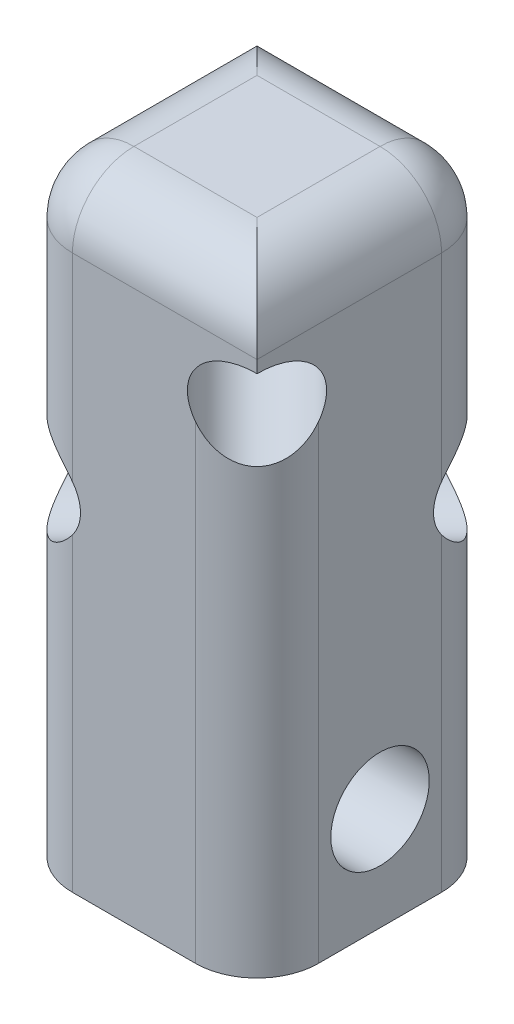
ISO-10303-21;
HEADER;
FILE_DESCRIPTION(('STEP AP214'),'2;1');
FILE_NAME('part.step','',(''),(''),'','','');
FILE_SCHEMA(('AUTOMOTIVE_DESIGN { 1 0 10303 214 1 1 1 1 }'));
ENDSEC;
DATA;
#1=APPLICATION_CONTEXT('core data for automotive mechanical design processes');
#2=APPLICATION_PROTOCOL_DEFINITION('international standard','automotive_design',2000,#1);
#3=PRODUCT_CONTEXT('',#1,'mechanical');
#4=PRODUCT('Part','Part','',(#3));
#5=PRODUCT_RELATED_PRODUCT_CATEGORY('part','',(#4));
#6=PRODUCT_DEFINITION_FORMATION('','',#4);
#7=PRODUCT_DEFINITION_CONTEXT('part definition',#1,'design');
#8=PRODUCT_DEFINITION('design','',#6,#7);
#9=PRODUCT_DEFINITION_SHAPE('','',#8);
#10=(LENGTH_UNIT() NAMED_UNIT(*) SI_UNIT(.MILLI.,.METRE.));
#11=(NAMED_UNIT(*) PLANE_ANGLE_UNIT() SI_UNIT($,.RADIAN.));
#12=(NAMED_UNIT(*) SI_UNIT($,.STERADIAN.) SOLID_ANGLE_UNIT());
#13=UNCERTAINTY_MEASURE_WITH_UNIT(LENGTH_MEASURE(1.E-05),#10,'distance_accuracy_value','');
#14=(GEOMETRIC_REPRESENTATION_CONTEXT(3) GLOBAL_UNCERTAINTY_ASSIGNED_CONTEXT((#13)) GLOBAL_UNIT_ASSIGNED_CONTEXT((#10,
#11,#12)) REPRESENTATION_CONTEXT('',''));
#15=CARTESIAN_POINT('',(0.,0.,0.));
#16=DIRECTION('',(0.,0.,1.));
#17=DIRECTION('',(1.,0.,0.));
#18=AXIS2_PLACEMENT_3D('',#15,#16,#17);
#19=CARTESIAN_POINT('',(3.,15.,3.));
#20=DIRECTION('',(-1.,0.,0.));
#21=DIRECTION('',(0.,0.,1.));
#22=AXIS2_PLACEMENT_3D('',#19,#20,#21);
#23=PLANE('',#22);
#24=CARTESIAN_POINT('',(3.,2.51,0.));
#25=DIRECTION('',(-1.,0.,0.));
#26=DIRECTION('',(0.,0.,1.));
#27=AXIS2_PLACEMENT_3D('',#24,#25,#26);
#28=CIRCLE('',#27,1.2);
#29=CARTESIAN_POINT('',(3.,2.51,1.2));
#30=VERTEX_POINT('',#29);
#31=EDGE_CURVE('E186',#30,#30,#28,.T.);
#32=ORIENTED_EDGE('',*,*,#31,.T.);
#33=EDGE_LOOP('',(#32));
#34=FACE_BOUND('',#33,.T.);
#35=CARTESIAN_POINT('',(3.,12.,3.));
#36=DIRECTION('',(-1.,0.,0.));
#37=DIRECTION('',(0.,0.,1.));
#38=AXIS2_PLACEMENT_3D('',#35,#36,#37);
#39=ELLIPSE('',#38,1.69705627484771,1.2);
#40=CARTESIAN_POINT('',(3.,13.2,3.));
#41=VERTEX_POINT('',#40);
#42=CARTESIAN_POINT('',(3.,11.4387513919839,1.5));
#43=VERTEX_POINT('',#42);
#44=EDGE_CURVE('E177',#41,#43,#39,.T.);
#45=ORIENTED_EDGE('',*,*,#44,.T.);
#46=DIRECTION('',(0.,-1.,0.));
#47=VECTOR('',#46,1.);
#48=CARTESIAN_POINT('',(3.,15.,1.5));
#49=LINE('',#48,#47);
#50=CARTESIAN_POINT('',(3.,0.,1.5));
#51=VERTEX_POINT('',#50);
#52=EDGE_CURVE('E244',#43,#51,#49,.T.);
#53=ORIENTED_EDGE('',*,*,#52,.T.);
#54=DIRECTION('',(0.,0.,-1.));
#55=VECTOR('',#54,1.);
#56=CARTESIAN_POINT('',(3.,0.,3.));
#57=LINE('',#56,#55);
#58=CARTESIAN_POINT('',(3.,0.,-1.5));
#59=VERTEX_POINT('',#58);
#60=EDGE_CURVE('E189',#51,#59,#57,.T.);
#61=ORIENTED_EDGE('',*,*,#60,.T.);
#62=DIRECTION('',(0.,-1.,0.));
#63=VECTOR('',#62,1.);
#64=CARTESIAN_POINT('',(3.,15.,-1.5));
#65=LINE('',#64,#63);
#66=CARTESIAN_POINT('',(3.,7.54875139198391,-1.5));
#67=VERTEX_POINT('',#66);
#68=EDGE_CURVE('E242',#59,#67,#65,.F.);
#69=ORIENTED_EDGE('',*,*,#68,.T.);
#70=CARTESIAN_POINT('',(3.,8.11,-3.));
#71=DIRECTION('',(-1.,0.,0.));
#72=DIRECTION('',(0.,0.,1.));
#73=AXIS2_PLACEMENT_3D('',#70,#71,#72);
#74=ELLIPSE('',#73,1.69705627484771,1.2);
#75=CARTESIAN_POINT('',(3.,8.67124860801609,-1.5));
#76=VERTEX_POINT('',#75);
#77=EDGE_CURVE('E180',#67,#76,#74,.T.);
#78=ORIENTED_EDGE('',*,*,#77,.T.);
#79=DIRECTION('',(0.,-1.,0.));
#80=VECTOR('',#79,1.);
#81=CARTESIAN_POINT('',(3.,15.,-1.5));
#82=LINE('',#81,#80);
#83=CARTESIAN_POINT('',(3.,13.5,-1.5));
#84=VERTEX_POINT('',#83);
#85=EDGE_CURVE('E52',#76,#84,#82,.F.);
#86=ORIENTED_EDGE('',*,*,#85,.T.);
#87=DIRECTION('',(0.,0.,-1.));
#88=VECTOR('',#87,1.);
#89=CARTESIAN_POINT('',(3.,13.5,3.));
#90=LINE('',#89,#88);
#91=CARTESIAN_POINT('',(3.,13.5,3.));
#92=VERTEX_POINT('',#91);
#93=EDGE_CURVE('E240',#84,#92,#90,.F.);
#94=ORIENTED_EDGE('',*,*,#93,.T.);
#95=DIRECTION('',(0.,-1.,0.));
#96=VECTOR('',#95,1.);
#97=CARTESIAN_POINT('',(3.,15.,3.));
#98=LINE('',#97,#96);
#99=EDGE_CURVE('E174',#92,#41,#98,.T.);
#100=ORIENTED_EDGE('',*,*,#99,.T.);
#101=EDGE_LOOP('',(#45,#53,#61,#69,#78,#86,#94,#100));
#102=FACE_BOUND('',#101,.T.);
#103=ADVANCED_FACE('F34',(#34,#102),#23,.F.);
#104=CARTESIAN_POINT('',(-3.,15.,-3.));
#105=DIRECTION('',(0.,0.,1.));
#106=DIRECTION('',(1.,0.,0.));
#107=AXIS2_PLACEMENT_3D('',#104,#105,#106);
#108=PLANE('',#107);
#109=CARTESIAN_POINT('',(3.,8.11,-3.));
#110=DIRECTION('',(0.,0.,1.));
#111=DIRECTION('',(-1.,0.,0.));
#112=AXIS2_PLACEMENT_3D('',#109,#110,#111);
#113=ELLIPSE('',#112,1.69705627484771,1.2);
#114=CARTESIAN_POINT('',(1.5,8.67124860801609,-3.));
#115=VERTEX_POINT('',#114);
#116=CARTESIAN_POINT('',(1.5,7.54875139198391,-3.));
#117=VERTEX_POINT('',#116);
#118=EDGE_CURVE('E338',#115,#117,#113,.T.);
#119=ORIENTED_EDGE('',*,*,#118,.T.);
#120=DIRECTION('',(0.,-1.,0.));
#121=VECTOR('',#120,1.);
#122=CARTESIAN_POINT('',(1.5,15.,-3.));
#123=LINE('',#122,#121);
#124=CARTESIAN_POINT('',(1.5,0.,-3.));
#125=VERTEX_POINT('',#124);
#126=EDGE_CURVE('E236',#117,#125,#123,.T.);
#127=ORIENTED_EDGE('',*,*,#126,.T.);
#128=DIRECTION('',(-1.,0.,0.));
#129=VECTOR('',#128,1.);
#130=CARTESIAN_POINT('',(-3.,0.,-3.));
#131=LINE('',#130,#129);
#132=CARTESIAN_POINT('',(-1.5,0.,-3.));
#133=VERTEX_POINT('',#132);
#134=EDGE_CURVE('E191',#125,#133,#131,.T.);
#135=ORIENTED_EDGE('',*,*,#134,.T.);
#136=DIRECTION('',(0.,-1.,0.));
#137=VECTOR('',#136,1.);
#138=CARTESIAN_POINT('',(-1.5,15.,-3.));
#139=LINE('',#138,#137);
#140=CARTESIAN_POINT('',(-1.5,11.4387513919839,-3.));
#141=VERTEX_POINT('',#140);
#142=EDGE_CURVE('E159',#133,#141,#139,.F.);
#143=ORIENTED_EDGE('',*,*,#142,.T.);
#144=CARTESIAN_POINT('',(-3.,12.,-3.));
#145=DIRECTION('',(0.,0.,1.));
#146=DIRECTION('',(1.,0.,0.));
#147=AXIS2_PLACEMENT_3D('',#144,#145,#146);
#148=ELLIPSE('',#147,1.69705627484771,1.2);
#149=CARTESIAN_POINT('',(-3.,13.2,-3.));
#150=VERTEX_POINT('',#149);
#151=EDGE_CURVE('E151',#141,#150,#148,.T.);
#152=ORIENTED_EDGE('',*,*,#151,.T.);
#153=DIRECTION('',(0.,-1.,0.));
#154=VECTOR('',#153,1.);
#155=CARTESIAN_POINT('',(-3.,15.,-3.));
#156=LINE('',#155,#154);
#157=CARTESIAN_POINT('',(-3.,13.5,-3.));
#158=VERTEX_POINT('',#157);
#159=EDGE_CURVE('E155',#158,#150,#156,.T.);
#160=ORIENTED_EDGE('',*,*,#159,.F.);
#161=DIRECTION('',(-1.,0.,0.));
#162=VECTOR('',#161,1.);
#163=CARTESIAN_POINT('',(-3.,13.5,-3.));
#164=LINE('',#163,#162);
#165=CARTESIAN_POINT('',(1.5,13.5,-3.));
#166=VERTEX_POINT('',#165);
#167=EDGE_CURVE('E234',#158,#166,#164,.F.);
#168=ORIENTED_EDGE('',*,*,#167,.T.);
#169=DIRECTION('',(0.,-1.,0.));
#170=VECTOR('',#169,1.);
#171=CARTESIAN_POINT('',(1.5,15.,-3.));
#172=LINE('',#171,#170);
#173=EDGE_CURVE('E232',#166,#115,#172,.T.);
#174=ORIENTED_EDGE('',*,*,#173,.T.);
#175=EDGE_LOOP('',(#119,#127,#135,#143,#152,#160,#168,#174));
#176=FACE_BOUND('',#175,.T.);
#177=ADVANCED_FACE('F154',(#176),#108,.F.);
#178=CARTESIAN_POINT('',(-3.,15.,3.));
#179=DIRECTION('',(1.,0.,0.));
#180=DIRECTION('',(0.,0.,-1.));
#181=AXIS2_PLACEMENT_3D('',#178,#179,#180);
#182=PLANE('',#181);
#183=CARTESIAN_POINT('',(-3.,2.51,0.));
#184=DIRECTION('',(-1.,0.,0.));
#185=DIRECTION('',(0.,0.,1.));
#186=AXIS2_PLACEMENT_3D('',#183,#184,#185);
#187=CIRCLE('',#186,1.2);
#188=CARTESIAN_POINT('',(-3.,2.51,1.2));
#189=VERTEX_POINT('',#188);
#190=EDGE_CURVE('E163',#189,#189,#187,.T.);
#191=ORIENTED_EDGE('',*,*,#190,.F.);
#192=EDGE_LOOP('',(#191));
#193=FACE_BOUND('',#192,.T.);
#194=DIRECTION('',(0.,-1.,0.));
#195=VECTOR('',#194,1.);
#196=CARTESIAN_POINT('',(-3.,15.,1.5));
#197=LINE('',#196,#195);
#198=CARTESIAN_POINT('',(-3.,8.67124860801609,1.5));
#199=VERTEX_POINT('',#198);
#200=CARTESIAN_POINT('',(-3.,13.5,1.5));
#201=VERTEX_POINT('',#200);
#202=EDGE_CURVE('E228',#199,#201,#197,.F.);
#203=ORIENTED_EDGE('',*,*,#202,.T.);
#204=DIRECTION('',(0.,0.,1.));
#205=VECTOR('',#204,1.);
#206=CARTESIAN_POINT('',(-3.,13.5,3.));
#207=LINE('',#206,#205);
#208=EDGE_CURVE('E172',#201,#158,#207,.F.);
#209=ORIENTED_EDGE('',*,*,#208,.T.);
#210=ORIENTED_EDGE('',*,*,#159,.T.);
#211=CARTESIAN_POINT('',(-3.,12.,-3.));
#212=DIRECTION('',(1.,0.,0.));
#213=DIRECTION('',(0.,0.,1.));
#214=AXIS2_PLACEMENT_3D('',#211,#212,#213);
#215=ELLIPSE('',#214,1.69705627484771,1.2);
#216=CARTESIAN_POINT('',(-3.,11.4387513919839,-1.5));
#217=VERTEX_POINT('',#216);
#218=EDGE_CURVE('E164',#150,#217,#215,.T.);
#219=ORIENTED_EDGE('',*,*,#218,.T.);
#220=DIRECTION('',(0.,-1.,0.));
#221=VECTOR('',#220,1.);
#222=CARTESIAN_POINT('',(-3.,15.,-1.5));
#223=LINE('',#222,#221);
#224=CARTESIAN_POINT('',(-3.,0.,-1.5));
#225=VERTEX_POINT('',#224);
#226=EDGE_CURVE('E224',#217,#225,#223,.T.);
#227=ORIENTED_EDGE('',*,*,#226,.T.);
#228=DIRECTION('',(0.,0.,1.));
#229=VECTOR('',#228,1.);
#230=CARTESIAN_POINT('',(-3.,0.,3.));
#231=LINE('',#230,#229);
#232=CARTESIAN_POINT('',(-3.,0.,1.5));
#233=VERTEX_POINT('',#232);
#234=EDGE_CURVE('E193',#225,#233,#231,.T.);
#235=ORIENTED_EDGE('',*,*,#234,.T.);
#236=DIRECTION('',(0.,-1.,0.));
#237=VECTOR('',#236,1.);
#238=CARTESIAN_POINT('',(-3.,15.,1.5));
#239=LINE('',#238,#237);
#240=CARTESIAN_POINT('',(-3.,7.54875139198391,1.5));
#241=VERTEX_POINT('',#240);
#242=EDGE_CURVE('E226',#233,#241,#239,.F.);
#243=ORIENTED_EDGE('',*,*,#242,.T.);
#244=CARTESIAN_POINT('',(-3.,8.11,3.));
#245=DIRECTION('',(1.,0.,0.));
#246=DIRECTION('',(0.,0.,1.));
#247=AXIS2_PLACEMENT_3D('',#244,#245,#246);
#248=ELLIPSE('',#247,1.69705627484771,1.2);
#249=EDGE_CURVE('E333',#241,#199,#248,.T.);
#250=ORIENTED_EDGE('',*,*,#249,.T.);
#251=EDGE_LOOP('',(#203,#209,#210,#219,#227,#235,#243,#250));
#252=FACE_BOUND('',#251,.T.);
#253=ADVANCED_FACE('F168',(#193,#252),#182,.F.);
#254=CARTESIAN_POINT('',(-3.,15.,3.));
#255=DIRECTION('',(0.,0.,-1.));
#256=DIRECTION('',(-1.,0.,0.));
#257=AXIS2_PLACEMENT_3D('',#254,#255,#256);
#258=PLANE('',#257);
#259=ORIENTED_EDGE('',*,*,#99,.F.);
#260=DIRECTION('',(1.,0.,0.));
#261=VECTOR('',#260,1.);
#262=CARTESIAN_POINT('',(-3.,13.5,3.));
#263=LINE('',#262,#261);
#264=CARTESIAN_POINT('',(-1.5,13.5,3.));
#265=VERTEX_POINT('',#264);
#266=EDGE_CURVE('E221',#92,#265,#263,.F.);
#267=ORIENTED_EDGE('',*,*,#266,.T.);
#268=DIRECTION('',(0.,-1.,0.));
#269=VECTOR('',#268,1.);
#270=CARTESIAN_POINT('',(-1.5,15.,3.));
#271=LINE('',#270,#269);
#272=CARTESIAN_POINT('',(-1.5,8.67124860801609,3.));
#273=VERTEX_POINT('',#272);
#274=EDGE_CURVE('E219',#265,#273,#271,.T.);
#275=ORIENTED_EDGE('',*,*,#274,.T.);
#276=CARTESIAN_POINT('',(-3.,8.11,3.));
#277=DIRECTION('',(0.,0.,-1.));
#278=DIRECTION('',(-1.,0.,0.));
#279=AXIS2_PLACEMENT_3D('',#276,#277,#278);
#280=ELLIPSE('',#279,1.69705627484771,1.2);
#281=CARTESIAN_POINT('',(-1.5,7.54875139198391,3.));
#282=VERTEX_POINT('',#281);
#283=EDGE_CURVE('E202',#273,#282,#280,.T.);
#284=ORIENTED_EDGE('',*,*,#283,.T.);
#285=DIRECTION('',(0.,-1.,0.));
#286=VECTOR('',#285,1.);
#287=CARTESIAN_POINT('',(-1.5,15.,3.));
#288=LINE('',#287,#286);
#289=CARTESIAN_POINT('',(-1.5,0.,3.));
#290=VERTEX_POINT('',#289);
#291=EDGE_CURVE('E216',#282,#290,#288,.T.);
#292=ORIENTED_EDGE('',*,*,#291,.T.);
#293=DIRECTION('',(1.,0.,0.));
#294=VECTOR('',#293,1.);
#295=CARTESIAN_POINT('',(-3.,0.,3.));
#296=LINE('',#295,#294);
#297=CARTESIAN_POINT('',(1.5,0.,3.));
#298=VERTEX_POINT('',#297);
#299=EDGE_CURVE('E196',#290,#298,#296,.T.);
#300=ORIENTED_EDGE('',*,*,#299,.T.);
#301=DIRECTION('',(0.,-1.,0.));
#302=VECTOR('',#301,1.);
#303=CARTESIAN_POINT('',(1.5,15.,3.));
#304=LINE('',#303,#302);
#305=CARTESIAN_POINT('',(1.5,11.4387513919839,3.));
#306=VERTEX_POINT('',#305);
#307=EDGE_CURVE('E214',#298,#306,#304,.F.);
#308=ORIENTED_EDGE('',*,*,#307,.T.);
#309=CARTESIAN_POINT('',(3.,12.,3.));
#310=DIRECTION('',(0.,0.,-1.));
#311=DIRECTION('',(1.,0.,0.));
#312=AXIS2_PLACEMENT_3D('',#309,#310,#311);
#313=ELLIPSE('',#312,1.69705627484771,1.2);
#314=EDGE_CURVE('E173',#306,#41,#313,.T.);
#315=ORIENTED_EDGE('',*,*,#314,.T.);
#316=EDGE_LOOP('',(#259,#267,#275,#284,#292,#300,#308,#315));
#317=FACE_BOUND('',#316,.T.);
#318=ADVANCED_FACE('F359',(#317),#258,.F.);
#319=CARTESIAN_POINT('',(0.,15.,0.));
#320=DIRECTION('',(0.,-1.,0.));
#321=DIRECTION('',(0.,0.,-1.));
#322=AXIS2_PLACEMENT_3D('',#319,#320,#321);
#323=PLANE('',#322);
#324=DIRECTION('',(0.,0.,1.));
#325=VECTOR('',#324,1.);
#326=CARTESIAN_POINT('',(-1.5,15.,0.));
#327=LINE('',#326,#325);
#328=CARTESIAN_POINT('',(-1.5,15.,-1.5));
#329=VERTEX_POINT('',#328);
#330=CARTESIAN_POINT('',(-1.5,15.,1.5));
#331=VERTEX_POINT('',#330);
#332=EDGE_CURVE('E209',#329,#331,#327,.T.);
#333=ORIENTED_EDGE('',*,*,#332,.T.);
#334=DIRECTION('',(1.,0.,0.));
#335=VECTOR('',#334,1.);
#336=CARTESIAN_POINT('',(0.,15.,1.5));
#337=LINE('',#336,#335);
#338=CARTESIAN_POINT('',(1.5,15.,1.5));
#339=VERTEX_POINT('',#338);
#340=EDGE_CURVE('E211',#331,#339,#337,.T.);
#341=ORIENTED_EDGE('',*,*,#340,.T.);
#342=DIRECTION('',(0.,0.,-1.));
#343=VECTOR('',#342,1.);
#344=CARTESIAN_POINT('',(1.5,15.,0.));
#345=LINE('',#344,#343);
#346=CARTESIAN_POINT('',(1.5,15.,-1.5));
#347=VERTEX_POINT('',#346);
#348=EDGE_CURVE('E205',#339,#347,#345,.T.);
#349=ORIENTED_EDGE('',*,*,#348,.T.);
#350=DIRECTION('',(-1.,0.,0.));
#351=VECTOR('',#350,1.);
#352=CARTESIAN_POINT('',(0.,15.,-1.5));
#353=LINE('',#352,#351);
#354=EDGE_CURVE('E207',#347,#329,#353,.T.);
#355=ORIENTED_EDGE('',*,*,#354,.T.);
#356=EDGE_LOOP('',(#333,#341,#349,#355));
#357=FACE_BOUND('',#356,.T.);
#358=ADVANCED_FACE('F426',(#357),#323,.F.);
#359=CARTESIAN_POINT('',(0.,0.,0.));
#360=DIRECTION('',(0.,-1.,0.));
#361=DIRECTION('',(0.,0.,-1.));
#362=AXIS2_PLACEMENT_3D('',#359,#360,#361);
#363=PLANE('',#362);
#364=ORIENTED_EDGE('',*,*,#299,.F.);
#365=CARTESIAN_POINT('',(-1.5,0.,1.5));
#366=DIRECTION('',(0.,-1.,0.));
#367=DIRECTION('',(0.,0.,-1.));
#368=AXIS2_PLACEMENT_3D('',#365,#366,#367);
#369=CIRCLE('',#368,1.5);
#370=EDGE_CURVE('E377',#290,#233,#369,.T.);
#371=ORIENTED_EDGE('',*,*,#370,.T.);
#372=ORIENTED_EDGE('',*,*,#234,.F.);
#373=CARTESIAN_POINT('',(-1.5,0.,-1.5));
#374=DIRECTION('',(0.,-1.,0.));
#375=DIRECTION('',(0.,0.,-1.));
#376=AXIS2_PLACEMENT_3D('',#373,#374,#375);
#377=CIRCLE('',#376,1.5);
#378=EDGE_CURVE('E385',#225,#133,#377,.T.);
#379=ORIENTED_EDGE('',*,*,#378,.T.);
#380=ORIENTED_EDGE('',*,*,#134,.F.);
#381=CARTESIAN_POINT('',(1.5,0.,-1.5));
#382=DIRECTION('',(0.,-1.,0.));
#383=DIRECTION('',(0.,0.,-1.));
#384=AXIS2_PLACEMENT_3D('',#381,#382,#383);
#385=CIRCLE('',#384,1.5);
#386=EDGE_CURVE('E60',#125,#59,#385,.T.);
#387=ORIENTED_EDGE('',*,*,#386,.T.);
#388=ORIENTED_EDGE('',*,*,#60,.F.);
#389=CARTESIAN_POINT('',(1.5,0.,1.5));
#390=DIRECTION('',(0.,-1.,0.));
#391=DIRECTION('',(0.,0.,-1.));
#392=AXIS2_PLACEMENT_3D('',#389,#390,#391);
#393=CIRCLE('',#392,1.5);
#394=EDGE_CURVE('E382',#51,#298,#393,.T.);
#395=ORIENTED_EDGE('',*,*,#394,.T.);
#396=EDGE_LOOP('',(#364,#371,#372,#379,#380,#387,#388,#395));
#397=FACE_BOUND('',#396,.T.);
#398=ADVANCED_FACE('F380',(#397),#363,.T.);
#399=CARTESIAN_POINT('',(12.,2.51,0.));
#400=DIRECTION('',(-1.,0.,0.));
#401=DIRECTION('',(0.,0.,1.));
#402=AXIS2_PLACEMENT_3D('',#399,#400,#401);
#403=CYLINDRICAL_SURFACE('',#402,1.2);
#404=ORIENTED_EDGE('',*,*,#190,.T.);
#405=EDGE_LOOP('',(#404));
#406=FACE_BOUND('',#405,.T.);
#407=ORIENTED_EDGE('',*,*,#31,.F.);
#408=EDGE_LOOP('',(#407));
#409=FACE_BOUND('',#408,.T.);
#410=ADVANCED_FACE('F433',(#406,#409),#403,.F.);
#411=CARTESIAN_POINT('',(-7.60660171779821,12.,-7.60660171779821));
#412=DIRECTION('',(0.707106781186548,0.,0.707106781186547));
#413=DIRECTION('',(0.707106781186547,0.,-0.707106781186548));
#414=AXIS2_PLACEMENT_3D('',#411,#412,#413);
#415=CYLINDRICAL_SURFACE('',#414,1.2);
#416=ORIENTED_EDGE('',*,*,#314,.F.);
#417=CARTESIAN_POINT('',(1.5,11.4387513919839,3.));
#418=CARTESIAN_POINT('',(1.52435238785926,11.4062461975705,3.0000074515174));
#419=CARTESIAN_POINT('',(1.55001612930455,11.3747397057503,2.99940758255962));
#420=CARTESIAN_POINT('',(1.60356389924525,11.3137207581794,2.99665870005444));
#421=CARTESIAN_POINT('',(1.63144883162327,11.2842091233317,2.99450905295214));
#422=CARTESIAN_POINT('',(1.68922788372254,11.2269932745064,2.98830279467517));
#423=CARTESIAN_POINT('',(1.71913528451921,11.1993039673503,2.98423226003079));
#424=CARTESIAN_POINT('',(1.78042594318513,11.1460785321026,2.97388176448269));
#425=CARTESIAN_POINT('',(1.8118088444034,11.1205418878053,2.96760233514802));
#426=CARTESIAN_POINT('',(1.89723339880849,11.0553695706189,2.94748647509328));
#427=CARTESIAN_POINT('',(1.95234954790152,11.0177707390881,2.93140653768891));
#428=CARTESIAN_POINT('',(2.06411128967546,10.9502314737592,2.89114681668331));
#429=CARTESIAN_POINT('',(2.12075132312417,10.9202665222661,2.86699355513648));
#430=CARTESIAN_POINT('',(2.22389299870696,10.8738015788768,2.81480652308525));
#431=CARTESIAN_POINT('',(2.27045070783101,10.8558680914832,2.78817044643175));
#432=CARTESIAN_POINT('',(2.36191320866964,10.827088081442,2.72884922948924));
#433=CARTESIAN_POINT('',(2.4068184375871,10.8162396713613,2.69616570319359));
#434=CARTESIAN_POINT('',(2.49356733388494,10.8022888196947,2.62515589219097));
#435=CARTESIAN_POINT('',(2.53539860642305,10.7992162280983,2.58680845876118));
#436=CARTESIAN_POINT('',(2.61433780032811,10.8011248270367,2.5057099716425));
#437=CARTESIAN_POINT('',(2.65144597069576,10.8061055928108,2.46295915031423));
#438=CARTESIAN_POINT('',(2.7177395323759,10.823200268423,2.37741363170884));
#439=CARTESIAN_POINT('',(2.74727894795471,10.8348397890415,2.33479505583408));
#440=CARTESIAN_POINT('',(2.80099386614687,10.8642362183168,2.24833654501655));
#441=CARTESIAN_POINT('',(2.8251686795713,10.8819939122265,2.20449645395944));
#442=CARTESIAN_POINT('',(2.8700639875279,10.9246273832382,2.11297789456667));
#443=CARTESIAN_POINT('',(2.89031001616575,10.9499832298712,2.06529288613751));
#444=CARTESIAN_POINT('',(2.92501996243675,11.0061171423633,1.97100683921804));
#445=CARTESIAN_POINT('',(2.93947781816251,11.0369008444405,1.92440698503992));
#446=CARTESIAN_POINT('',(2.96567100694087,11.1098659596398,1.82405881020048));
#447=CARTESIAN_POINT('',(2.97626097649177,11.1530929360853,1.77077543766531));
#448=CARTESIAN_POINT('',(2.99136055131722,11.2455077571502,1.66879535569749));
#449=CARTESIAN_POINT('',(2.9958760805606,11.2946897431633,1.62009422071846));
#450=CARTESIAN_POINT('',(2.99879126532978,11.3615884107878,1.56161074225773));
#451=CARTESIAN_POINT('',(2.99925565378302,11.3766982879452,1.54886822458433));
#452=CARTESIAN_POINT('',(2.99985975991714,11.4073750307874,1.52397915380118));
#453=CARTESIAN_POINT('',(2.99999989376271,11.4229412847067,1.51183185638863));
#454=CARTESIAN_POINT('',(3.00000000000125,11.4387513919833,1.49999999999933));
#455=B_SPLINE_CURVE_WITH_KNOTS('',3,(#417,#418,#419,#420,#421,#422,#423,#424,#425,#426,#427,
#428,#429,#430,#431,#432,#433,#434,#435,#436,#437,#438,#439,#440,#441,#442,#443,#444,#445,#446,
#447,#448,#449,#450,#451,#452,#453,#454),.UNSPECIFIED.,.F.,.F.,(4,2,2,2,2,2,2,2,2,2,2,2,2,2,2,2,
2,2,4),(0.,0.121789996948119,0.243629810339532,0.366366667496226,0.489074008291936,
0.694115816831217,0.898490546976693,1.06745031583965,1.23636505619535,1.4059272534096,
1.57548050764337,1.73423763896801,1.893015153984,2.06541826614772,2.23800146533319,
2.44555670313568,2.65290938000605,2.71221089742097,2.77143626196664),.UNSPECIFIED.);
#456=EDGE_CURVE('E11',#306,#43,#455,.T.);
#457=ORIENTED_EDGE('',*,*,#456,.T.);
#458=ORIENTED_EDGE('',*,*,#44,.F.);
#459=EDGE_LOOP('',(#416,#457,#458));
#460=FACE_BOUND('',#459,.T.);
#461=ORIENTED_EDGE('',*,*,#151,.F.);
#462=CARTESIAN_POINT('',(-1.5,11.4387513919839,-3.));
#463=CARTESIAN_POINT('',(-1.52435238785926,11.4062461975705,-3.0000074515174));
#464=CARTESIAN_POINT('',(-1.55001612930455,11.3747397057503,-2.99940758255962));
#465=CARTESIAN_POINT('',(-1.60356389924524,11.3137207581794,-2.99665870005445));
#466=CARTESIAN_POINT('',(-1.63144883162327,11.2842091233317,-2.99450905295214));
#467=CARTESIAN_POINT('',(-1.68922788372254,11.2269932745064,-2.98830279467517));
#468=CARTESIAN_POINT('',(-1.7191352845192,11.1993039673503,-2.9842322600308));
#469=CARTESIAN_POINT('',(-1.78042594318512,11.1460785321026,-2.97388176448269));
#470=CARTESIAN_POINT('',(-1.8118088444034,11.1205418878053,-2.96760233514802));
#471=CARTESIAN_POINT('',(-1.89723339880849,11.0553695706189,-2.94748647509328));
#472=CARTESIAN_POINT('',(-1.95234954790152,11.0177707390881,-2.93140653768891));
#473=CARTESIAN_POINT('',(-2.06411128967546,10.9502314737592,-2.89114681668331));
#474=CARTESIAN_POINT('',(-2.12075132312417,10.9202665222661,-2.86699355513648));
#475=CARTESIAN_POINT('',(-2.22389299870696,10.8738015788768,-2.81480652308525));
#476=CARTESIAN_POINT('',(-2.27045070783101,10.8558680914832,-2.78817044643175));
#477=CARTESIAN_POINT('',(-2.36191320866964,10.827088081442,-2.72884922948924));
#478=CARTESIAN_POINT('',(-2.4068184375871,10.8162396713613,-2.6961657031936));
#479=CARTESIAN_POINT('',(-2.49356733388494,10.8022888196947,-2.62515589219098));
#480=CARTESIAN_POINT('',(-2.53539860642305,10.7992162280983,-2.58680845876119));
#481=CARTESIAN_POINT('',(-2.6143378003281,10.8011248270367,-2.5057099716425));
#482=CARTESIAN_POINT('',(-2.65144597069576,10.8061055928108,-2.46295915031423));
#483=CARTESIAN_POINT('',(-2.7177395323759,10.823200268423,-2.37741363170884));
#484=CARTESIAN_POINT('',(-2.74727894795471,10.8348397890414,-2.33479505583408));
#485=CARTESIAN_POINT('',(-2.80099386614687,10.8642362183168,-2.24833654501656));
#486=CARTESIAN_POINT('',(-2.8251686795713,10.8819939122265,-2.20449645395944));
#487=CARTESIAN_POINT('',(-2.8700639875279,10.9246273832382,-2.11297789456667));
#488=CARTESIAN_POINT('',(-2.89031001616575,10.9499832298712,-2.06529288613752));
#489=CARTESIAN_POINT('',(-2.92501996243675,11.0061171423633,-1.97100683921805));
#490=CARTESIAN_POINT('',(-2.93947781816251,11.0369008444405,-1.92440698503992));
#491=CARTESIAN_POINT('',(-2.96567100694087,11.1098659596398,-1.82405881020048));
#492=CARTESIAN_POINT('',(-2.97626097649177,11.1530929360853,-1.77077543766531));
#493=CARTESIAN_POINT('',(-2.99136055131722,11.2455077571502,-1.6687953556975));
#494=CARTESIAN_POINT('',(-2.9958760805606,11.2946897431633,-1.62009422071846));
#495=CARTESIAN_POINT('',(-2.99879126532978,11.3615884107878,-1.56161074225774));
#496=CARTESIAN_POINT('',(-2.99925565378302,11.3766982879452,-1.54886822458434));
#497=CARTESIAN_POINT('',(-2.99985975991714,11.4073750307874,-1.52397915380118));
#498=CARTESIAN_POINT('',(-2.99999989376271,11.4229412847067,-1.51183185638863));
#499=CARTESIAN_POINT('',(-3.00000000000125,11.4387513919833,-1.49999999999933));
#500=B_SPLINE_CURVE_WITH_KNOTS('',3,(#462,#463,#464,#465,#466,#467,#468,#469,#470,#471,#472,
#473,#474,#475,#476,#477,#478,#479,#480,#481,#482,#483,#484,#485,#486,#487,#488,#489,#490,#491,
#492,#493,#494,#495,#496,#497,#498,#499),.UNSPECIFIED.,.F.,.F.,(4,2,2,2,2,2,2,2,2,2,2,2,2,2,2,2,
2,2,4),(0.,0.121789996948118,0.243629810339531,0.366366667496226,0.489074008291935,
0.694115816831219,0.898490546976694,1.06745031583966,1.23636505619535,1.4059272534096,
1.57548050764337,1.73423763896801,1.893015153984,2.06541826614772,2.23800146533319,
2.44555670313568,2.65290938000605,2.71221089742097,2.77143626196664),.UNSPECIFIED.);
#501=EDGE_CURVE('E44',#141,#217,#500,.T.);
#502=ORIENTED_EDGE('',*,*,#501,.T.);
#503=ORIENTED_EDGE('',*,*,#218,.F.);
#504=EDGE_LOOP('',(#461,#502,#503));
#505=FACE_BOUND('',#504,.T.);
#506=ADVANCED_FACE('F176',(#460,#505),#415,.F.);
#507=CARTESIAN_POINT('',(7.60660171779821,8.11,-7.60660171779821));
#508=DIRECTION('',(-0.707106781186548,0.,0.707106781186547));
#509=DIRECTION('',(0.707106781186547,0.,0.707106781186548));
#510=AXIS2_PLACEMENT_3D('',#507,#508,#509);
#511=CYLINDRICAL_SURFACE('',#510,1.2);
#512=ORIENTED_EDGE('',*,*,#283,.F.);
#513=CARTESIAN_POINT('',(-1.5,8.67124860801609,3.));
#514=CARTESIAN_POINT('',(-1.52435238785926,8.70375380242948,3.0000074515174));
#515=CARTESIAN_POINT('',(-1.55001612930455,8.73526029424969,2.99940758255962));
#516=CARTESIAN_POINT('',(-1.60356389924525,8.79627924182065,2.99665870005444));
#517=CARTESIAN_POINT('',(-1.63144883162327,8.82579087666833,2.99450905295214));
#518=CARTESIAN_POINT('',(-1.68922788372254,8.88300672549364,2.98830279467517));
#519=CARTESIAN_POINT('',(-1.71913528451921,8.9106960326497,2.98423226003079));
#520=CARTESIAN_POINT('',(-1.78042594318512,8.96392146789738,2.97388176448269));
#521=CARTESIAN_POINT('',(-1.8118088444034,8.98945811219472,2.96760233514802));
#522=CARTESIAN_POINT('',(-1.89723339880849,9.0546304293811,2.94748647509328));
#523=CARTESIAN_POINT('',(-1.95234954790152,9.09222926091189,2.93140653768891));
#524=CARTESIAN_POINT('',(-2.06411128967546,9.15976852624083,2.89114681668331));
#525=CARTESIAN_POINT('',(-2.12075132312417,9.18973347773387,2.86699355513648));
#526=CARTESIAN_POINT('',(-2.22389299870696,9.23619842112322,2.81480652308525));
#527=CARTESIAN_POINT('',(-2.27045070783101,9.25413190851677,2.78817044643175));
#528=CARTESIAN_POINT('',(-2.36191320866964,9.28291191855803,2.72884922948924));
#529=CARTESIAN_POINT('',(-2.4068184375871,9.29376032863869,2.69616570319359));
#530=CARTESIAN_POINT('',(-2.49356733388494,9.30771118030529,2.62515589219097));
#531=CARTESIAN_POINT('',(-2.53539860642305,9.31078377190172,2.58680845876118));
#532=CARTESIAN_POINT('',(-2.6143378003281,9.30887517296329,2.5057099716425));
#533=CARTESIAN_POINT('',(-2.65144597069576,9.30389440718919,2.46295915031423));
#534=CARTESIAN_POINT('',(-2.7177395323759,9.28679973157696,2.37741363170884));
#535=CARTESIAN_POINT('',(-2.74727894795471,9.27516021095855,2.33479505583408));
#536=CARTESIAN_POINT('',(-2.80099386614687,9.24576378168324,2.24833654501656));
#537=CARTESIAN_POINT('',(-2.8251686795713,9.2280060877735,2.20449645395944));
#538=CARTESIAN_POINT('',(-2.8700639875279,9.18537261676178,2.11297789456667));
#539=CARTESIAN_POINT('',(-2.89031001616575,9.16001677012882,2.06529288613752));
#540=CARTESIAN_POINT('',(-2.92501996243675,9.10388285763672,1.97100683921805));
#541=CARTESIAN_POINT('',(-2.93947781816251,9.0730991555595,1.92440698503992));
#542=CARTESIAN_POINT('',(-2.96567100694087,9.00013404036022,1.82405881020048));
#543=CARTESIAN_POINT('',(-2.97626097649177,8.95690706391466,1.77077543766531));
#544=CARTESIAN_POINT('',(-2.99136055131722,8.8644922428498,1.6687953556975));
#545=CARTESIAN_POINT('',(-2.9958760805606,8.81531025683675,1.62009422071846));
#546=CARTESIAN_POINT('',(-2.99879126532978,8.74841158921216,1.56161074225774));
#547=CARTESIAN_POINT('',(-2.99925565378302,8.73330171205484,1.54886822458434));
#548=CARTESIAN_POINT('',(-2.99985975991714,8.70262496921264,1.52397915380118));
#549=CARTESIAN_POINT('',(-2.99999989376271,8.68705871529329,1.51183185638863));
#550=CARTESIAN_POINT('',(-3.00000000000125,8.67124860801673,1.49999999999933));
#551=B_SPLINE_CURVE_WITH_KNOTS('',3,(#513,#514,#515,#516,#517,#518,#519,#520,#521,#522,#523,
#524,#525,#526,#527,#528,#529,#530,#531,#532,#533,#534,#535,#536,#537,#538,#539,#540,#541,#542,
#543,#544,#545,#546,#547,#548,#549,#550),.UNSPECIFIED.,.F.,.F.,(4,2,2,2,2,2,2,2,2,2,2,2,2,2,2,2,
2,2,4),(0.,0.121789996948119,0.243629810339531,0.366366667496225,0.489074008291934,
0.694115816831213,0.898490546976692,1.06745031583965,1.23636505619535,1.40592725340959,
1.57548050764337,1.73423763896801,1.893015153984,2.06541826614771,2.23800146533318,
2.44555670313568,2.65290938000604,2.71221089742097,2.77143626196664),.UNSPECIFIED.);
#552=EDGE_CURVE('E283',#273,#199,#551,.T.);
#553=ORIENTED_EDGE('',*,*,#552,.T.);
#554=ORIENTED_EDGE('',*,*,#249,.F.);
#555=CARTESIAN_POINT('',(-3.,7.54875139198391,1.5));
#556=CARTESIAN_POINT('',(-3.0000074515174,7.51624619757053,1.52435238785926));
#557=CARTESIAN_POINT('',(-2.99940758255962,7.48473970575032,1.55001612930455));
#558=CARTESIAN_POINT('',(-2.99665870005445,7.42372075817935,1.60356389924524));
#559=CARTESIAN_POINT('',(-2.99450905295214,7.39420912333168,1.63144883162327));
#560=CARTESIAN_POINT('',(-2.98830279467517,7.33699327450637,1.68922788372254));
#561=CARTESIAN_POINT('',(-2.98423226003079,7.30930396735031,1.71913528451921));
#562=CARTESIAN_POINT('',(-2.97388176448269,7.25607853210262,1.78042594318512));
#563=CARTESIAN_POINT('',(-2.96760233514802,7.23054188780529,1.8118088444034));
#564=CARTESIAN_POINT('',(-2.94748647509328,7.1653695706189,1.89723339880849));
#565=CARTESIAN_POINT('',(-2.93140653768891,7.12777073908811,1.95234954790152));
#566=CARTESIAN_POINT('',(-2.89114681668331,7.06023147375917,2.06411128967546));
#567=CARTESIAN_POINT('',(-2.86699355513648,7.03026652226614,2.12075132312417));
#568=CARTESIAN_POINT('',(-2.81480652308525,6.98380157887678,2.22389299870696));
#569=CARTESIAN_POINT('',(-2.78817044643175,6.96586809148323,2.27045070783101));
#570=CARTESIAN_POINT('',(-2.72884922948924,6.93708808144198,2.36191320866964));
#571=CARTESIAN_POINT('',(-2.69616570319359,6.92623967136131,2.4068184375871));
#572=CARTESIAN_POINT('',(-2.62515589219098,6.91228881969471,2.49356733388494));
#573=CARTESIAN_POINT('',(-2.58680845876118,6.90921622809828,2.53539860642305));
#574=CARTESIAN_POINT('',(-2.5057099716425,6.91112482703671,2.6143378003281));
#575=CARTESIAN_POINT('',(-2.46295915031423,6.91610559281081,2.65144597069576));
#576=CARTESIAN_POINT('',(-2.37741363170884,6.93320026842304,2.7177395323759));
#577=CARTESIAN_POINT('',(-2.33479505583408,6.94483978904145,2.74727894795471));
#578=CARTESIAN_POINT('',(-2.24833654501656,6.97423621831676,2.80099386614687));
#579=CARTESIAN_POINT('',(-2.20449645395944,6.99199391222651,2.8251686795713));
#580=CARTESIAN_POINT('',(-2.11297789456667,7.03462738323822,2.8700639875279));
#581=CARTESIAN_POINT('',(-2.06529288613751,7.05998322987118,2.89031001616575));
#582=CARTESIAN_POINT('',(-1.97100683921805,7.11611714236328,2.92501996243675));
#583=CARTESIAN_POINT('',(-1.92440698503992,7.1469008444405,2.93947781816251));
#584=CARTESIAN_POINT('',(-1.82405881020048,7.21986595963978,2.96567100694087));
#585=CARTESIAN_POINT('',(-1.77077543766531,7.26309293608534,2.97626097649177));
#586=CARTESIAN_POINT('',(-1.6687953556975,7.3555077571502,2.99136055131722));
#587=CARTESIAN_POINT('',(-1.62009422071846,7.40468974316325,2.9958760805606));
#588=CARTESIAN_POINT('',(-1.56161074225774,7.47158841078784,2.99879126532978));
#589=CARTESIAN_POINT('',(-1.54886822458434,7.48669828794516,2.99925565378302));
#590=CARTESIAN_POINT('',(-1.52397915380118,7.51737503078736,2.99985975991714));
#591=CARTESIAN_POINT('',(-1.51183185638863,7.53294128470671,2.99999989376271));
#592=CARTESIAN_POINT('',(-1.49999999999933,7.54875139198326,3.00000000000124));
#593=B_SPLINE_CURVE_WITH_KNOTS('',3,(#555,#556,#557,#558,#559,#560,#561,#562,#563,#564,#565,
#566,#567,#568,#569,#570,#571,#572,#573,#574,#575,#576,#577,#578,#579,#580,#581,#582,#583,#584,
#585,#586,#587,#588,#589,#590,#591,#592),.UNSPECIFIED.,.F.,.F.,(4,2,2,2,2,2,2,2,2,2,2,2,2,2,2,2,
2,2,4),(0.,0.121789996948119,0.243629810339532,0.366366667496227,0.489074008291935,
0.694115816831218,0.898490546976695,1.06745031583966,1.23636505619535,1.4059272534096,
1.57548050764337,1.73423763896801,1.893015153984,2.06541826614772,2.23800146533319,
2.44555670313568,2.65290938000604,2.71221089742097,2.77143626196664),.UNSPECIFIED.);
#594=EDGE_CURVE('E277',#241,#282,#593,.T.);
#595=ORIENTED_EDGE('',*,*,#594,.T.);
#596=EDGE_LOOP('',(#512,#553,#554,#595));
#597=FACE_BOUND('',#596,.T.);
#598=ORIENTED_EDGE('',*,*,#77,.F.);
#599=CARTESIAN_POINT('',(3.,7.54875139198391,-1.5));
#600=CARTESIAN_POINT('',(3.0000074515174,7.51624619757052,-1.52435238785926));
#601=CARTESIAN_POINT('',(2.99940758255962,7.48473970575031,-1.55001612930455));
#602=CARTESIAN_POINT('',(2.99665870005445,7.42372075817935,-1.60356389924525));
#603=CARTESIAN_POINT('',(2.99450905295214,7.39420912333167,-1.63144883162327));
#604=CARTESIAN_POINT('',(2.98830279467517,7.33699327450636,-1.68922788372254));
#605=CARTESIAN_POINT('',(2.98423226003079,7.3093039673503,-1.71913528451921));
#606=CARTESIAN_POINT('',(2.97388176448269,7.25607853210262,-1.78042594318513));
#607=CARTESIAN_POINT('',(2.96760233514802,7.23054188780528,-1.8118088444034));
#608=CARTESIAN_POINT('',(2.94748647509328,7.1653695706189,-1.8972333988085));
#609=CARTESIAN_POINT('',(2.93140653768891,7.12777073908811,-1.95234954790152));
#610=CARTESIAN_POINT('',(2.89114681668331,7.06023147375917,-2.06411128967546));
#611=CARTESIAN_POINT('',(2.86699355513648,7.03026652226613,-2.12075132312417));
#612=CARTESIAN_POINT('',(2.81480652308525,6.98380157887678,-2.22389299870696));
#613=CARTESIAN_POINT('',(2.78817044643175,6.96586809148323,-2.27045070783101));
#614=CARTESIAN_POINT('',(2.72884922948924,6.93708808144197,-2.36191320866964));
#615=CARTESIAN_POINT('',(2.69616570319359,6.92623967136131,-2.4068184375871));
#616=CARTESIAN_POINT('',(2.62515589219097,6.91228881969471,-2.49356733388494));
#617=CARTESIAN_POINT('',(2.58680845876118,6.90921622809828,-2.53539860642305));
#618=CARTESIAN_POINT('',(2.5057099716425,6.91112482703671,-2.61433780032811));
#619=CARTESIAN_POINT('',(2.46295915031423,6.91610559281081,-2.65144597069576));
#620=CARTESIAN_POINT('',(2.37741363170884,6.93320026842304,-2.7177395323759));
#621=CARTESIAN_POINT('',(2.33479505583409,6.94483978904145,-2.74727894795471));
#622=CARTESIAN_POINT('',(2.24833654501656,6.97423621831676,-2.80099386614687));
#623=CARTESIAN_POINT('',(2.20449645395944,6.99199391222651,-2.8251686795713));
#624=CARTESIAN_POINT('',(2.11297789456667,7.03462738323822,-2.8700639875279));
#625=CARTESIAN_POINT('',(2.06529288613752,7.05998322987118,-2.89031001616575));
#626=CARTESIAN_POINT('',(1.97100683921805,7.11611714236328,-2.92501996243675));
#627=CARTESIAN_POINT('',(1.92440698503992,7.1469008444405,-2.93947781816251));
#628=CARTESIAN_POINT('',(1.82405881020048,7.21986595963979,-2.96567100694087));
#629=CARTESIAN_POINT('',(1.77077543766531,7.26309293608534,-2.97626097649177));
#630=CARTESIAN_POINT('',(1.6687953556975,7.35550775715021,-2.99136055131722));
#631=CARTESIAN_POINT('',(1.62009422071846,7.40468974316325,-2.9958760805606));
#632=CARTESIAN_POINT('',(1.56161074225774,7.47158841078784,-2.99879126532978));
#633=CARTESIAN_POINT('',(1.54886822458434,7.48669828794516,-2.99925565378302));
#634=CARTESIAN_POINT('',(1.52397915380118,7.51737503078737,-2.99985975991714));
#635=CARTESIAN_POINT('',(1.51183185638863,7.53294128470672,-2.99999989376271));
#636=CARTESIAN_POINT('',(1.49999999999933,7.54875139198327,-3.00000000000125));
#637=B_SPLINE_CURVE_WITH_KNOTS('',3,(#599,#600,#601,#602,#603,#604,#605,#606,#607,#608,#609,
#610,#611,#612,#613,#614,#615,#616,#617,#618,#619,#620,#621,#622,#623,#624,#625,#626,#627,#628,
#629,#630,#631,#632,#633,#634,#635,#636),.UNSPECIFIED.,.F.,.F.,(4,2,2,2,2,2,2,2,2,2,2,2,2,2,2,2,
2,2,4),(0.,0.121789996948119,0.243629810339533,0.366366667496227,0.489074008291936,
0.694115816831217,0.898490546976694,1.06745031583966,1.23636505619535,1.40592725340959,
1.57548050764337,1.73423763896801,1.893015153984,2.06541826614771,2.23800146533318,
2.44555670313568,2.65290938000604,2.71221089742097,2.77143626196664),.UNSPECIFIED.);
#638=EDGE_CURVE('E255',#67,#117,#637,.T.);
#639=ORIENTED_EDGE('',*,*,#638,.T.);
#640=ORIENTED_EDGE('',*,*,#118,.F.);
#641=CARTESIAN_POINT('',(1.5,8.67124860801609,-3.));
#642=CARTESIAN_POINT('',(1.52435238785926,8.70375380242947,-3.0000074515174));
#643=CARTESIAN_POINT('',(1.55001612930455,8.73526029424968,-2.99940758255962));
#644=CARTESIAN_POINT('',(1.60356389924525,8.79627924182065,-2.99665870005445));
#645=CARTESIAN_POINT('',(1.63144883162327,8.82579087666832,-2.99450905295214));
#646=CARTESIAN_POINT('',(1.68922788372254,8.88300672549363,-2.98830279467517));
#647=CARTESIAN_POINT('',(1.71913528451921,8.91069603264969,-2.98423226003079));
#648=CARTESIAN_POINT('',(1.78042594318512,8.96392146789738,-2.97388176448269));
#649=CARTESIAN_POINT('',(1.8118088444034,8.98945811219471,-2.96760233514802));
#650=CARTESIAN_POINT('',(1.89723339880849,9.0546304293811,-2.94748647509328));
#651=CARTESIAN_POINT('',(1.95234954790152,9.09222926091189,-2.93140653768891));
#652=CARTESIAN_POINT('',(2.06411128967546,9.15976852624082,-2.89114681668331));
#653=CARTESIAN_POINT('',(2.12075132312417,9.18973347773387,-2.86699355513648));
#654=CARTESIAN_POINT('',(2.22389299870696,9.23619842112322,-2.81480652308525));
#655=CARTESIAN_POINT('',(2.27045070783101,9.25413190851677,-2.78817044643175));
#656=CARTESIAN_POINT('',(2.36191320866964,9.28291191855803,-2.72884922948924));
#657=CARTESIAN_POINT('',(2.4068184375871,9.29376032863869,-2.6961657031936));
#658=CARTESIAN_POINT('',(2.49356733388494,9.30771118030529,-2.62515589219098));
#659=CARTESIAN_POINT('',(2.53539860642305,9.31078377190172,-2.58680845876119));
#660=CARTESIAN_POINT('',(2.6143378003281,9.30887517296329,-2.5057099716425));
#661=CARTESIAN_POINT('',(2.65144597069576,9.30389440718919,-2.46295915031423));
#662=CARTESIAN_POINT('',(2.7177395323759,9.28679973157696,-2.37741363170884));
#663=CARTESIAN_POINT('',(2.7472789479547,9.27516021095855,-2.33479505583409));
#664=CARTESIAN_POINT('',(2.80099386614687,9.24576378168324,-2.24833654501656));
#665=CARTESIAN_POINT('',(2.8251686795713,9.2280060877735,-2.20449645395944));
#666=CARTESIAN_POINT('',(2.8700639875279,9.18537261676178,-2.11297789456667));
#667=CARTESIAN_POINT('',(2.89031001616575,9.16001677012882,-2.06529288613752));
#668=CARTESIAN_POINT('',(2.92501996243675,9.10388285763672,-1.97100683921805));
#669=CARTESIAN_POINT('',(2.93947781816251,9.07309915555951,-1.92440698503992));
#670=CARTESIAN_POINT('',(2.96567100694087,9.00013404036022,-1.82405881020048));
#671=CARTESIAN_POINT('',(2.97626097649177,8.95690706391466,-1.77077543766531));
#672=CARTESIAN_POINT('',(2.99136055131722,8.8644922428498,-1.6687953556975));
#673=CARTESIAN_POINT('',(2.9958760805606,8.81531025683675,-1.62009422071846));
#674=CARTESIAN_POINT('',(2.99879126532978,8.74841158921216,-1.56161074225774));
#675=CARTESIAN_POINT('',(2.99925565378302,8.73330171205485,-1.54886822458434));
#676=CARTESIAN_POINT('',(2.99985975991714,8.70262496921264,-1.52397915380118));
#677=CARTESIAN_POINT('',(2.99999989376271,8.68705871529329,-1.51183185638863));
#678=CARTESIAN_POINT('',(3.00000000000125,8.67124860801674,-1.49999999999933));
#679=B_SPLINE_CURVE_WITH_KNOTS('',3,(#641,#642,#643,#644,#645,#646,#647,#648,#649,#650,#651,
#652,#653,#654,#655,#656,#657,#658,#659,#660,#661,#662,#663,#664,#665,#666,#667,#668,#669,#670,
#671,#672,#673,#674,#675,#676,#677,#678),.UNSPECIFIED.,.F.,.F.,(4,2,2,2,2,2,2,2,2,2,2,2,2,2,2,2,
2,2,4),(0.,0.12178999694812,0.243629810339532,0.366366667496226,0.489074008291935,
0.694115816831214,0.898490546976694,1.06745031583966,1.23636505619535,1.4059272534096,
1.57548050764337,1.73423763896801,1.893015153984,2.06541826614772,2.23800146533318,
2.44555670313568,2.65290938000604,2.71221089742097,2.77143626196664),.UNSPECIFIED.);
#680=EDGE_CURVE('E247',#115,#76,#679,.T.);
#681=ORIENTED_EDGE('',*,*,#680,.T.);
#682=EDGE_LOOP('',(#598,#639,#640,#681));
#683=FACE_BOUND('',#682,.T.);
#684=ADVANCED_FACE('F265',(#597,#683),#511,.F.);
#685=CARTESIAN_POINT('',(0.,13.5,-1.5));
#686=DIRECTION('',(-1.,0.,0.));
#687=DIRECTION('',(0.,0.,1.));
#688=AXIS2_PLACEMENT_3D('',#685,#686,#687);
#689=CYLINDRICAL_SURFACE('',#688,1.5);
#690=CARTESIAN_POINT('',(1.5,13.5,-1.5));
#691=DIRECTION('',(1.,0.,0.));
#692=DIRECTION('',(0.,1.,0.));
#693=AXIS2_PLACEMENT_3D('',#690,#691,#692);
#694=CIRCLE('',#693,1.5);
#695=EDGE_CURVE('E327',#166,#347,#694,.T.);
#696=ORIENTED_EDGE('',*,*,#695,.F.);
#697=ORIENTED_EDGE('',*,*,#167,.F.);
#698=CARTESIAN_POINT('',(-1.5,13.5,-1.5));
#699=DIRECTION('',(-0.707106781186547,0.,0.707106781186547));
#700=DIRECTION('',(-0.707106781186547,0.,-0.707106781186547));
#701=AXIS2_PLACEMENT_3D('',#698,#699,#700);
#702=ELLIPSE('',#701,2.12132034355964,1.5);
#703=EDGE_CURVE('E39',#329,#158,#702,.T.);
#704=ORIENTED_EDGE('',*,*,#703,.F.);
#705=ORIENTED_EDGE('',*,*,#354,.F.);
#706=EDGE_LOOP('',(#696,#697,#704,#705));
#707=FACE_BOUND('',#706,.T.);
#708=ADVANCED_FACE('F269',(#707),#689,.T.);
#709=CARTESIAN_POINT('',(1.5,15.,-1.5));
#710=DIRECTION('',(0.,-1.,0.));
#711=DIRECTION('',(0.,0.,-1.));
#712=AXIS2_PLACEMENT_3D('',#709,#710,#711);
#713=CYLINDRICAL_SURFACE('',#712,1.5);
#714=ORIENTED_EDGE('',*,*,#680,.F.);
#715=ORIENTED_EDGE('',*,*,#173,.F.);
#716=CARTESIAN_POINT('',(1.5,13.5,-1.5));
#717=DIRECTION('',(0.,1.,0.));
#718=DIRECTION('',(0.,0.,1.));
#719=AXIS2_PLACEMENT_3D('',#716,#717,#718);
#720=CIRCLE('',#719,1.5);
#721=EDGE_CURVE('E325',#84,#166,#720,.T.);
#722=ORIENTED_EDGE('',*,*,#721,.F.);
#723=ORIENTED_EDGE('',*,*,#85,.F.);
#724=EDGE_LOOP('',(#714,#715,#722,#723));
#725=FACE_BOUND('',#724,.T.);
#726=ADVANCED_FACE('F261',(#725),#713,.T.);
#727=CARTESIAN_POINT('',(-1.5,15.,1.5));
#728=DIRECTION('',(0.,-1.,0.));
#729=DIRECTION('',(0.,0.,-1.));
#730=AXIS2_PLACEMENT_3D('',#727,#728,#729);
#731=CYLINDRICAL_SURFACE('',#730,1.5);
#732=ORIENTED_EDGE('',*,*,#552,.F.);
#733=ORIENTED_EDGE('',*,*,#274,.F.);
#734=CARTESIAN_POINT('',(-1.5,13.5,1.5));
#735=DIRECTION('',(0.,1.,0.));
#736=DIRECTION('',(0.,0.,1.));
#737=AXIS2_PLACEMENT_3D('',#734,#735,#736);
#738=CIRCLE('',#737,1.5);
#739=EDGE_CURVE('E322',#201,#265,#738,.T.);
#740=ORIENTED_EDGE('',*,*,#739,.F.);
#741=ORIENTED_EDGE('',*,*,#202,.F.);
#742=EDGE_LOOP('',(#732,#733,#740,#741));
#743=FACE_BOUND('',#742,.T.);
#744=ADVANCED_FACE('F372',(#743),#731,.T.);
#745=CARTESIAN_POINT('',(-1.5,13.5,0.));
#746=DIRECTION('',(0.,0.,1.));
#747=DIRECTION('',(1.,0.,0.));
#748=AXIS2_PLACEMENT_3D('',#745,#746,#747);
#749=CYLINDRICAL_SURFACE('',#748,1.5);
#750=ORIENTED_EDGE('',*,*,#703,.T.);
#751=ORIENTED_EDGE('',*,*,#208,.F.);
#752=CARTESIAN_POINT('',(-1.5,13.5,1.5));
#753=DIRECTION('',(0.,0.,1.));
#754=DIRECTION('',(1.,0.,0.));
#755=AXIS2_PLACEMENT_3D('',#752,#753,#754);
#756=CIRCLE('',#755,1.5);
#757=EDGE_CURVE('E319',#331,#201,#756,.T.);
#758=ORIENTED_EDGE('',*,*,#757,.F.);
#759=ORIENTED_EDGE('',*,*,#332,.F.);
#760=EDGE_LOOP('',(#750,#751,#758,#759));
#761=FACE_BOUND('',#760,.T.);
#762=ADVANCED_FACE('F411',(#761),#749,.T.);
#763=CARTESIAN_POINT('',(1.5,13.5,-1.5));
#764=DIRECTION('',(0.,0.,1.));
#765=DIRECTION('',(1.,0.,0.));
#766=AXIS2_PLACEMENT_3D('',#763,#764,#765);
#767=SPHERICAL_SURFACE('',#766,1.5);
#768=ORIENTED_EDGE('',*,*,#721,.T.);
#769=ORIENTED_EDGE('',*,*,#695,.T.);
#770=CARTESIAN_POINT('',(1.5,13.5,-1.5));
#771=DIRECTION('',(0.,0.,-1.));
#772=DIRECTION('',(-1.,0.,0.));
#773=AXIS2_PLACEMENT_3D('',#770,#771,#772);
#774=CIRCLE('',#773,1.5);
#775=EDGE_CURVE('E316',#84,#347,#774,.F.);
#776=ORIENTED_EDGE('',*,*,#775,.F.);
#777=EDGE_LOOP('',(#768,#769,#776));
#778=FACE_BOUND('',#777,.T.);
#779=ADVANCED_FACE('F351',(#778),#767,.T.);
#780=CARTESIAN_POINT('',(-1.5,13.5,1.5));
#781=DIRECTION('',(0.,0.,1.));
#782=DIRECTION('',(1.,0.,0.));
#783=AXIS2_PLACEMENT_3D('',#780,#781,#782);
#784=SPHERICAL_SURFACE('',#783,1.5);
#785=ORIENTED_EDGE('',*,*,#757,.T.);
#786=ORIENTED_EDGE('',*,*,#739,.T.);
#787=CARTESIAN_POINT('',(-1.5,13.5,1.5));
#788=DIRECTION('',(-1.,0.,0.));
#789=DIRECTION('',(0.,0.,1.));
#790=AXIS2_PLACEMENT_3D('',#787,#788,#789);
#791=CIRCLE('',#790,1.5);
#792=EDGE_CURVE('E314',#331,#265,#791,.F.);
#793=ORIENTED_EDGE('',*,*,#792,.F.);
#794=EDGE_LOOP('',(#785,#786,#793));
#795=FACE_BOUND('',#794,.T.);
#796=ADVANCED_FACE('F368',(#795),#784,.T.);
#797=CARTESIAN_POINT('',(1.5,13.5,0.));
#798=DIRECTION('',(0.,0.,-1.));
#799=DIRECTION('',(-1.,0.,0.));
#800=AXIS2_PLACEMENT_3D('',#797,#798,#799);
#801=CYLINDRICAL_SURFACE('',#800,1.5);
#802=ORIENTED_EDGE('',*,*,#775,.T.);
#803=ORIENTED_EDGE('',*,*,#348,.F.);
#804=CARTESIAN_POINT('',(1.5,13.5,1.5));
#805=DIRECTION('',(0.707106781186547,0.,-0.707106781186547));
#806=DIRECTION('',(-0.707106781186547,0.,-0.707106781186547));
#807=AXIS2_PLACEMENT_3D('',#804,#805,#806);
#808=ELLIPSE('',#807,2.12132034355964,1.5);
#809=EDGE_CURVE('E312',#92,#339,#808,.F.);
#810=ORIENTED_EDGE('',*,*,#809,.F.);
#811=ORIENTED_EDGE('',*,*,#93,.F.);
#812=EDGE_LOOP('',(#802,#803,#810,#811));
#813=FACE_BOUND('',#812,.T.);
#814=ADVANCED_FACE('F355',(#813),#801,.T.);
#815=CARTESIAN_POINT('',(0.,13.5,1.5));
#816=DIRECTION('',(1.,0.,0.));
#817=DIRECTION('',(0.,0.,-1.));
#818=AXIS2_PLACEMENT_3D('',#815,#816,#817);
#819=CYLINDRICAL_SURFACE('',#818,1.5);
#820=ORIENTED_EDGE('',*,*,#792,.T.);
#821=ORIENTED_EDGE('',*,*,#266,.F.);
#822=ORIENTED_EDGE('',*,*,#809,.T.);
#823=ORIENTED_EDGE('',*,*,#340,.F.);
#824=EDGE_LOOP('',(#820,#821,#822,#823));
#825=FACE_BOUND('',#824,.T.);
#826=ADVANCED_FACE('F294',(#825),#819,.T.);
#827=CARTESIAN_POINT('',(-1.5,15.,1.5));
#828=DIRECTION('',(0.,-1.,0.));
#829=DIRECTION('',(0.,0.,-1.));
#830=AXIS2_PLACEMENT_3D('',#827,#828,#829);
#831=CYLINDRICAL_SURFACE('',#830,1.5);
#832=ORIENTED_EDGE('',*,*,#594,.F.);
#833=ORIENTED_EDGE('',*,*,#242,.F.);
#834=ORIENTED_EDGE('',*,*,#370,.F.);
#835=ORIENTED_EDGE('',*,*,#291,.F.);
#836=EDGE_LOOP('',(#832,#833,#834,#835));
#837=FACE_BOUND('',#836,.T.);
#838=ADVANCED_FACE('F289',(#837),#831,.T.);
#839=CARTESIAN_POINT('',(1.5,15.,1.5));
#840=DIRECTION('',(0.,-1.,0.));
#841=DIRECTION('',(0.,0.,-1.));
#842=AXIS2_PLACEMENT_3D('',#839,#840,#841);
#843=CYLINDRICAL_SURFACE('',#842,1.5);
#844=ORIENTED_EDGE('',*,*,#456,.F.);
#845=ORIENTED_EDGE('',*,*,#307,.F.);
#846=ORIENTED_EDGE('',*,*,#394,.F.);
#847=ORIENTED_EDGE('',*,*,#52,.F.);
#848=EDGE_LOOP('',(#844,#845,#846,#847));
#849=FACE_BOUND('',#848,.T.);
#850=ADVANCED_FACE('F293',(#849),#843,.T.);
#851=CARTESIAN_POINT('',(1.5,15.,-1.5));
#852=DIRECTION('',(0.,-1.,0.));
#853=DIRECTION('',(0.,0.,-1.));
#854=AXIS2_PLACEMENT_3D('',#851,#852,#853);
#855=CYLINDRICAL_SURFACE('',#854,1.5);
#856=ORIENTED_EDGE('',*,*,#638,.F.);
#857=ORIENTED_EDGE('',*,*,#68,.F.);
#858=ORIENTED_EDGE('',*,*,#386,.F.);
#859=ORIENTED_EDGE('',*,*,#126,.F.);
#860=EDGE_LOOP('',(#856,#857,#858,#859));
#861=FACE_BOUND('',#860,.T.);
#862=ADVANCED_FACE('F298',(#861),#855,.T.);
#863=CARTESIAN_POINT('',(-1.5,15.,-1.5));
#864=DIRECTION('',(0.,-1.,0.));
#865=DIRECTION('',(0.,0.,-1.));
#866=AXIS2_PLACEMENT_3D('',#863,#864,#865);
#867=CYLINDRICAL_SURFACE('',#866,1.5);
#868=ORIENTED_EDGE('',*,*,#501,.F.);
#869=ORIENTED_EDGE('',*,*,#142,.F.);
#870=ORIENTED_EDGE('',*,*,#378,.F.);
#871=ORIENTED_EDGE('',*,*,#226,.F.);
#872=EDGE_LOOP('',(#868,#869,#870,#871));
#873=FACE_BOUND('',#872,.T.);
#874=ADVANCED_FACE('F36',(#873),#867,.T.);
#875=CLOSED_SHELL('',(#103,#177,#253,#318,#358,#398,#410,#506,#684,#708,#726,#744,#762,#779,
#796,#814,#826,#838,#850,#862,#874));
#876=MANIFOLD_SOLID_BREP('B2',#875);
#877=ADVANCED_BREP_SHAPE_REPRESENTATION('',(#18,#876),#14);
#878=SHAPE_DEFINITION_REPRESENTATION(#9,#877);
ENDSEC;
END-ISO-10303-21;
